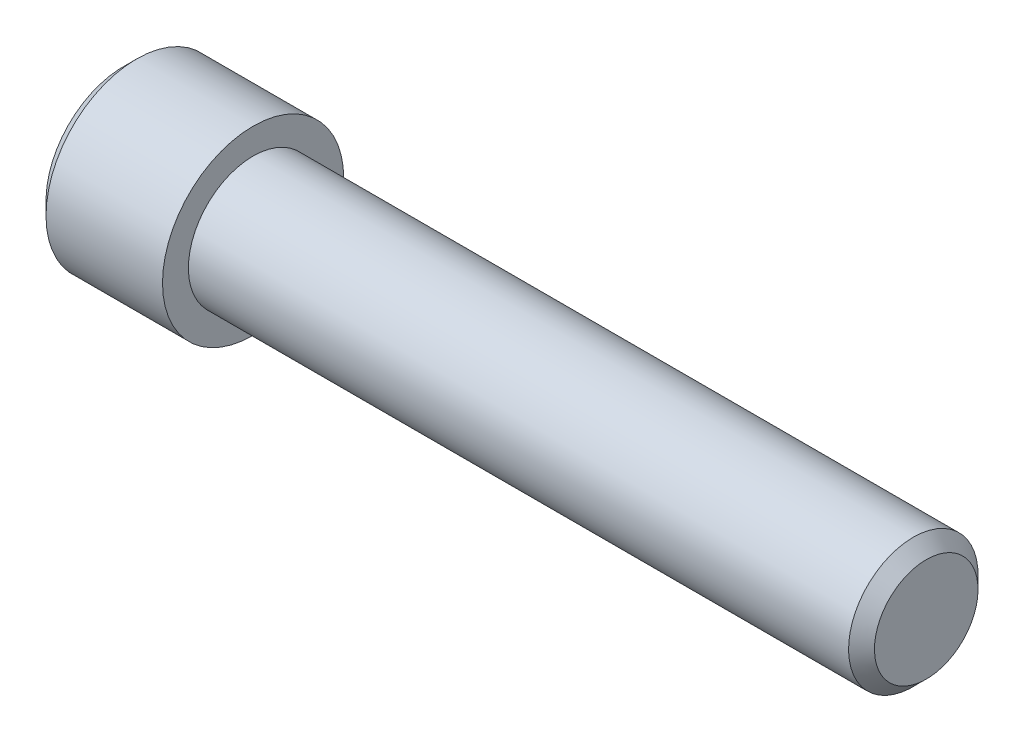
ISO-10303-21;
HEADER;
FILE_DESCRIPTION(('STEP AP214'),'2;1');
FILE_NAME('part.step','',(''),(''),'','','');
FILE_SCHEMA(('AUTOMOTIVE_DESIGN { 1 0 10303 214 1 1 1 1 }'));
ENDSEC;
DATA;
#1=APPLICATION_CONTEXT('core data for automotive mechanical design processes');
#2=APPLICATION_PROTOCOL_DEFINITION('international standard','automotive_design',2000,#1);
#3=PRODUCT_CONTEXT('',#1,'mechanical');
#4=PRODUCT('Part','Part','',(#3));
#5=PRODUCT_RELATED_PRODUCT_CATEGORY('part','',(#4));
#6=PRODUCT_DEFINITION_FORMATION('','',#4);
#7=PRODUCT_DEFINITION_CONTEXT('part definition',#1,'design');
#8=PRODUCT_DEFINITION('design','',#6,#7);
#9=PRODUCT_DEFINITION_SHAPE('','',#8);
#10=(LENGTH_UNIT() NAMED_UNIT(*) SI_UNIT(.MILLI.,.METRE.));
#11=(NAMED_UNIT(*) PLANE_ANGLE_UNIT() SI_UNIT($,.RADIAN.));
#12=(NAMED_UNIT(*) SI_UNIT($,.STERADIAN.) SOLID_ANGLE_UNIT());
#13=UNCERTAINTY_MEASURE_WITH_UNIT(LENGTH_MEASURE(1.E-05),#10,'distance_accuracy_value','');
#14=(GEOMETRIC_REPRESENTATION_CONTEXT(3) GLOBAL_UNCERTAINTY_ASSIGNED_CONTEXT((#13)) GLOBAL_UNIT_ASSIGNED_CONTEXT((#10,
#11,#12)) REPRESENTATION_CONTEXT('',''));
#15=CARTESIAN_POINT('',(0.,0.,0.));
#16=DIRECTION('',(0.,0.,1.));
#17=DIRECTION('',(1.,0.,0.));
#18=AXIS2_PLACEMENT_3D('',#15,#16,#17);
#19=CARTESIAN_POINT('',(0.,0.,0.));
#20=DIRECTION('',(-1.,0.,0.));
#21=DIRECTION('',(0.,-1.,0.));
#22=AXIS2_PLACEMENT_3D('',#19,#20,#21);
#23=PLANE('',#22);
#24=CARTESIAN_POINT('',(0.,0.,0.));
#25=DIRECTION('',(-1.,0.,0.));
#26=DIRECTION('',(0.,-1.,0.));
#27=AXIS2_PLACEMENT_3D('',#24,#25,#26);
#28=CIRCLE('',#27,3.00000000000001);
#29=CARTESIAN_POINT('',(0.,-3.00000000000001,0.));
#30=VERTEX_POINT('',#29);
#31=EDGE_CURVE('E11',#30,#30,#28,.T.);
#32=ORIENTED_EDGE('',*,*,#31,.T.);
#33=EDGE_LOOP('',(#32));
#34=FACE_BOUND('',#33,.T.);
#35=DIRECTION('',(0.,0.5,-0.866025403784439));
#36=VECTOR('',#35,1.);
#37=CARTESIAN_POINT('',(0.,1.25,2.1650635094611));
#38=LINE('',#37,#36);
#39=CARTESIAN_POINT('',(0.,1.25,2.1650635094611));
#40=VERTEX_POINT('',#39);
#41=CARTESIAN_POINT('',(0.,2.5,0.));
#42=VERTEX_POINT('',#41);
#43=EDGE_CURVE('E67',#40,#42,#38,.T.);
#44=ORIENTED_EDGE('',*,*,#43,.F.);
#45=DIRECTION('',(0.,1.,0.));
#46=VECTOR('',#45,1.);
#47=CARTESIAN_POINT('',(0.,-1.25,2.1650635094611));
#48=LINE('',#47,#46);
#49=CARTESIAN_POINT('',(0.,-1.25,2.1650635094611));
#50=VERTEX_POINT('',#49);
#51=EDGE_CURVE('E150',#50,#40,#48,.T.);
#52=ORIENTED_EDGE('',*,*,#51,.F.);
#53=DIRECTION('',(0.,0.5,0.866025403784439));
#54=VECTOR('',#53,1.);
#55=CARTESIAN_POINT('',(0.,-2.5,0.));
#56=LINE('',#55,#54);
#57=CARTESIAN_POINT('',(0.,-2.5,0.));
#58=VERTEX_POINT('',#57);
#59=EDGE_CURVE('E148',#58,#50,#56,.T.);
#60=ORIENTED_EDGE('',*,*,#59,.F.);
#61=DIRECTION('',(0.,-0.5,0.866025403784439));
#62=VECTOR('',#61,1.);
#63=CARTESIAN_POINT('',(0.,-1.25,-2.1650635094611));
#64=LINE('',#63,#62);
#65=CARTESIAN_POINT('',(0.,-1.25,-2.1650635094611));
#66=VERTEX_POINT('',#65);
#67=EDGE_CURVE('E115',#66,#58,#64,.T.);
#68=ORIENTED_EDGE('',*,*,#67,.F.);
#69=DIRECTION('',(0.,-1.,0.));
#70=VECTOR('',#69,1.);
#71=CARTESIAN_POINT('',(0.,1.25,-2.1650635094611));
#72=LINE('',#71,#70);
#73=CARTESIAN_POINT('',(0.,1.25,-2.1650635094611));
#74=VERTEX_POINT('',#73);
#75=EDGE_CURVE('E144',#74,#66,#72,.T.);
#76=ORIENTED_EDGE('',*,*,#75,.F.);
#77=DIRECTION('',(0.,-0.5,-0.866025403784439));
#78=VECTOR('',#77,1.);
#79=CARTESIAN_POINT('',(0.,2.5,0.));
#80=LINE('',#79,#78);
#81=EDGE_CURVE('E141',#42,#74,#80,.T.);
#82=ORIENTED_EDGE('',*,*,#81,.F.);
#83=EDGE_LOOP('',(#44,#52,#60,#68,#76,#82));
#84=FACE_BOUND('',#83,.T.);
#85=ADVANCED_FACE('F51',(#34,#84),#23,.T.);
#86=CARTESIAN_POINT('',(31.,0.,0.));
#87=DIRECTION('',(1.,0.,0.));
#88=DIRECTION('',(0.,1.,0.));
#89=AXIS2_PLACEMENT_3D('',#86,#87,#88);
#90=CYLINDRICAL_SURFACE('',#89,3.5);
#91=CARTESIAN_POINT('',(0.499999999999994,0.,0.));
#92=DIRECTION('',(-1.,0.,0.));
#93=DIRECTION('',(0.,-1.,0.));
#94=AXIS2_PLACEMENT_3D('',#91,#92,#93);
#95=CIRCLE('',#94,3.5);
#96=CARTESIAN_POINT('',(0.499999999999994,-3.5,0.));
#97=VERTEX_POINT('',#96);
#98=EDGE_CURVE('E60',#97,#97,#95,.F.);
#99=ORIENTED_EDGE('',*,*,#98,.T.);
#100=EDGE_LOOP('',(#99));
#101=FACE_BOUND('',#100,.T.);
#102=CARTESIAN_POINT('',(5.,0.,0.));
#103=DIRECTION('',(1.,0.,0.));
#104=DIRECTION('',(0.,1.,0.));
#105=AXIS2_PLACEMENT_3D('',#102,#103,#104);
#106=CIRCLE('',#105,3.5);
#107=CARTESIAN_POINT('',(5.,3.5,0.));
#108=VERTEX_POINT('',#107);
#109=EDGE_CURVE('E162',#108,#108,#106,.T.);
#110=ORIENTED_EDGE('',*,*,#109,.F.);
#111=EDGE_LOOP('',(#110));
#112=FACE_BOUND('',#111,.T.);
#113=ADVANCED_FACE('F173',(#101,#112),#90,.T.);
#114=CARTESIAN_POINT('',(5.,3.5,0.));
#115=DIRECTION('',(1.,0.,0.));
#116=DIRECTION('',(0.,1.,0.));
#117=AXIS2_PLACEMENT_3D('',#114,#115,#116);
#118=PLANE('',#117);
#119=ORIENTED_EDGE('',*,*,#109,.T.);
#120=EDGE_LOOP('',(#119));
#121=FACE_BOUND('',#120,.T.);
#122=CARTESIAN_POINT('',(5.,0.,0.));
#123=DIRECTION('',(1.,0.,0.));
#124=DIRECTION('',(0.,1.,0.));
#125=AXIS2_PLACEMENT_3D('',#122,#123,#124);
#126=CIRCLE('',#125,2.5);
#127=CARTESIAN_POINT('',(5.,2.5,0.));
#128=VERTEX_POINT('',#127);
#129=EDGE_CURVE('E154',#128,#128,#126,.T.);
#130=ORIENTED_EDGE('',*,*,#129,.F.);
#131=EDGE_LOOP('',(#130));
#132=FACE_BOUND('',#131,.T.);
#133=ADVANCED_FACE('F192',(#121,#132),#118,.T.);
#134=CARTESIAN_POINT('',(31.,0.,0.));
#135=DIRECTION('',(1.,0.,0.));
#136=DIRECTION('',(0.,1.,0.));
#137=AXIS2_PLACEMENT_3D('',#134,#135,#136);
#138=CYLINDRICAL_SURFACE('',#137,2.5);
#139=CARTESIAN_POINT('',(30.5,0.,0.));
#140=DIRECTION('',(1.,0.,0.));
#141=DIRECTION('',(0.,1.,0.));
#142=AXIS2_PLACEMENT_3D('',#139,#140,#141);
#143=CIRCLE('',#142,2.5);
#144=CARTESIAN_POINT('',(30.5,2.50000000000001,0.));
#145=VERTEX_POINT('',#144);
#146=EDGE_CURVE('E168',#145,#145,#143,.F.);
#147=ORIENTED_EDGE('',*,*,#146,.T.);
#148=EDGE_LOOP('',(#147));
#149=FACE_BOUND('',#148,.T.);
#150=ORIENTED_EDGE('',*,*,#129,.T.);
#151=EDGE_LOOP('',(#150));
#152=FACE_BOUND('',#151,.T.);
#153=ADVANCED_FACE('F203',(#149,#152),#138,.T.);
#154=CARTESIAN_POINT('',(31.,2.5,0.));
#155=DIRECTION('',(1.,0.,0.));
#156=DIRECTION('',(0.,1.,0.));
#157=AXIS2_PLACEMENT_3D('',#154,#155,#156);
#158=PLANE('',#157);
#159=CARTESIAN_POINT('',(31.,0.,0.));
#160=DIRECTION('',(1.,0.,0.));
#161=DIRECTION('',(0.,1.,0.));
#162=AXIS2_PLACEMENT_3D('',#159,#160,#161);
#163=CIRCLE('',#162,2.);
#164=CARTESIAN_POINT('',(31.,2.,0.));
#165=VERTEX_POINT('',#164);
#166=EDGE_CURVE('E165',#165,#165,#163,.T.);
#167=ORIENTED_EDGE('',*,*,#166,.T.);
#168=EDGE_LOOP('',(#167));
#169=FACE_BOUND('',#168,.T.);
#170=ADVANCED_FACE('F207',(#169),#158,.T.);
#171=CARTESIAN_POINT('',(3.,1.25,2.1650635094611));
#172=DIRECTION('',(0.,0.866025403784439,0.5));
#173=DIRECTION('',(0.,-0.5,0.866025403784439));
#174=AXIS2_PLACEMENT_3D('',#171,#172,#173);
#175=PLANE('',#174);
#176=ORIENTED_EDGE('',*,*,#43,.T.);
#177=DIRECTION('',(-1.,0.,0.));
#178=VECTOR('',#177,1.);
#179=CARTESIAN_POINT('',(3.,2.5,0.));
#180=LINE('',#179,#178);
#181=CARTESIAN_POINT('',(3.,2.5,0.));
#182=VERTEX_POINT('',#181);
#183=EDGE_CURVE('E97',#182,#42,#180,.T.);
#184=ORIENTED_EDGE('',*,*,#183,.F.);
#185=DIRECTION('',(0.,0.5,-0.866025403784439));
#186=VECTOR('',#185,1.);
#187=CARTESIAN_POINT('',(3.,1.25,2.1650635094611));
#188=LINE('',#187,#186);
#189=CARTESIAN_POINT('',(3.,1.25,2.1650635094611));
#190=VERTEX_POINT('',#189);
#191=EDGE_CURVE('E152',#190,#182,#188,.T.);
#192=ORIENTED_EDGE('',*,*,#191,.F.);
#193=DIRECTION('',(-1.,0.,0.));
#194=VECTOR('',#193,1.);
#195=CARTESIAN_POINT('',(3.,1.25,2.1650635094611));
#196=LINE('',#195,#194);
#197=EDGE_CURVE('E75',#190,#40,#196,.T.);
#198=ORIENTED_EDGE('',*,*,#197,.T.);
#199=EDGE_LOOP('',(#176,#184,#192,#198));
#200=FACE_BOUND('',#199,.T.);
#201=ADVANCED_FACE('F211',(#200),#175,.F.);
#202=CARTESIAN_POINT('',(3.,-1.25,2.1650635094611));
#203=DIRECTION('',(0.,0.,1.));
#204=DIRECTION('',(1.,0.,0.));
#205=AXIS2_PLACEMENT_3D('',#202,#203,#204);
#206=PLANE('',#205);
#207=ORIENTED_EDGE('',*,*,#51,.T.);
#208=ORIENTED_EDGE('',*,*,#197,.F.);
#209=DIRECTION('',(0.,1.,0.));
#210=VECTOR('',#209,1.);
#211=CARTESIAN_POINT('',(3.,-1.25,2.1650635094611));
#212=LINE('',#211,#210);
#213=CARTESIAN_POINT('',(3.,-1.25,2.1650635094611));
#214=VERTEX_POINT('',#213);
#215=EDGE_CURVE('E127',#214,#190,#212,.T.);
#216=ORIENTED_EDGE('',*,*,#215,.F.);
#217=DIRECTION('',(-1.,0.,0.));
#218=VECTOR('',#217,1.);
#219=CARTESIAN_POINT('',(3.,-1.25,2.1650635094611));
#220=LINE('',#219,#218);
#221=EDGE_CURVE('E119',#214,#50,#220,.T.);
#222=ORIENTED_EDGE('',*,*,#221,.T.);
#223=EDGE_LOOP('',(#207,#208,#216,#222));
#224=FACE_BOUND('',#223,.T.);
#225=ADVANCED_FACE('F215',(#224),#206,.F.);
#226=CARTESIAN_POINT('',(3.,-2.5,0.));
#227=DIRECTION('',(0.,-0.866025403784439,0.5));
#228=DIRECTION('',(0.,-0.5,-0.866025403784439));
#229=AXIS2_PLACEMENT_3D('',#226,#227,#228);
#230=PLANE('',#229);
#231=ORIENTED_EDGE('',*,*,#59,.T.);
#232=ORIENTED_EDGE('',*,*,#221,.F.);
#233=DIRECTION('',(0.,0.5,0.866025403784439));
#234=VECTOR('',#233,1.);
#235=CARTESIAN_POINT('',(3.,-2.5,0.));
#236=LINE('',#235,#234);
#237=CARTESIAN_POINT('',(3.,-2.5,0.));
#238=VERTEX_POINT('',#237);
#239=EDGE_CURVE('E123',#238,#214,#236,.T.);
#240=ORIENTED_EDGE('',*,*,#239,.F.);
#241=DIRECTION('',(-1.,0.,0.));
#242=VECTOR('',#241,1.);
#243=CARTESIAN_POINT('',(3.,-2.5,0.));
#244=LINE('',#243,#242);
#245=EDGE_CURVE('E108',#238,#58,#244,.T.);
#246=ORIENTED_EDGE('',*,*,#245,.T.);
#247=EDGE_LOOP('',(#231,#232,#240,#246));
#248=FACE_BOUND('',#247,.T.);
#249=ADVANCED_FACE('F124',(#248),#230,.F.);
#250=CARTESIAN_POINT('',(3.,-1.25,-2.1650635094611));
#251=DIRECTION('',(0.,-0.866025403784438,-0.5));
#252=DIRECTION('',(0.,0.5,-0.866025403784439));
#253=AXIS2_PLACEMENT_3D('',#250,#251,#252);
#254=PLANE('',#253);
#255=ORIENTED_EDGE('',*,*,#67,.T.);
#256=ORIENTED_EDGE('',*,*,#245,.F.);
#257=DIRECTION('',(0.,-0.5,0.866025403784439));
#258=VECTOR('',#257,1.);
#259=CARTESIAN_POINT('',(3.,-1.25,-2.1650635094611));
#260=LINE('',#259,#258);
#261=CARTESIAN_POINT('',(3.,-1.25,-2.1650635094611));
#262=VERTEX_POINT('',#261);
#263=EDGE_CURVE('E112',#262,#238,#260,.T.);
#264=ORIENTED_EDGE('',*,*,#263,.F.);
#265=DIRECTION('',(-1.,0.,0.));
#266=VECTOR('',#265,1.);
#267=CARTESIAN_POINT('',(3.,-1.25,-2.1650635094611));
#268=LINE('',#267,#266);
#269=EDGE_CURVE('E120',#262,#66,#268,.T.);
#270=ORIENTED_EDGE('',*,*,#269,.T.);
#271=EDGE_LOOP('',(#255,#256,#264,#270));
#272=FACE_BOUND('',#271,.T.);
#273=ADVANCED_FACE('F110',(#272),#254,.F.);
#274=CARTESIAN_POINT('',(3.,1.25,-2.1650635094611));
#275=DIRECTION('',(0.,0.,-1.));
#276=DIRECTION('',(-1.,0.,0.));
#277=AXIS2_PLACEMENT_3D('',#274,#275,#276);
#278=PLANE('',#277);
#279=ORIENTED_EDGE('',*,*,#75,.T.);
#280=ORIENTED_EDGE('',*,*,#269,.F.);
#281=DIRECTION('',(0.,-1.,0.));
#282=VECTOR('',#281,1.);
#283=CARTESIAN_POINT('',(3.,1.25,-2.1650635094611));
#284=LINE('',#283,#282);
#285=CARTESIAN_POINT('',(3.,1.25,-2.1650635094611));
#286=VERTEX_POINT('',#285);
#287=EDGE_CURVE('E133',#286,#262,#284,.T.);
#288=ORIENTED_EDGE('',*,*,#287,.F.);
#289=DIRECTION('',(-1.,0.,0.));
#290=VECTOR('',#289,1.);
#291=CARTESIAN_POINT('',(3.,1.25,-2.1650635094611));
#292=LINE('',#291,#290);
#293=EDGE_CURVE('E157',#286,#74,#292,.T.);
#294=ORIENTED_EDGE('',*,*,#293,.T.);
#295=EDGE_LOOP('',(#279,#280,#288,#294));
#296=FACE_BOUND('',#295,.T.);
#297=ADVANCED_FACE('F219',(#296),#278,.F.);
#298=CARTESIAN_POINT('',(3.,2.5,0.));
#299=DIRECTION('',(0.,0.866025403784439,-0.5));
#300=DIRECTION('',(0.,0.5,0.866025403784439));
#301=AXIS2_PLACEMENT_3D('',#298,#299,#300);
#302=PLANE('',#301);
#303=ORIENTED_EDGE('',*,*,#81,.T.);
#304=ORIENTED_EDGE('',*,*,#293,.F.);
#305=DIRECTION('',(0.,-0.5,-0.866025403784439));
#306=VECTOR('',#305,1.);
#307=CARTESIAN_POINT('',(3.,2.5,0.));
#308=LINE('',#307,#306);
#309=EDGE_CURVE('E135',#182,#286,#308,.T.);
#310=ORIENTED_EDGE('',*,*,#309,.F.);
#311=ORIENTED_EDGE('',*,*,#183,.T.);
#312=EDGE_LOOP('',(#303,#304,#310,#311));
#313=FACE_BOUND('',#312,.T.);
#314=ADVANCED_FACE('F216',(#313),#302,.F.);
#315=CARTESIAN_POINT('',(3.,0.,0.));
#316=DIRECTION('',(-1.,0.,0.));
#317=DIRECTION('',(0.,-1.,0.));
#318=AXIS2_PLACEMENT_3D('',#315,#316,#317);
#319=PLANE('',#318);
#320=ORIENTED_EDGE('',*,*,#191,.T.);
#321=ORIENTED_EDGE('',*,*,#309,.T.);
#322=ORIENTED_EDGE('',*,*,#287,.T.);
#323=ORIENTED_EDGE('',*,*,#263,.T.);
#324=ORIENTED_EDGE('',*,*,#239,.T.);
#325=ORIENTED_EDGE('',*,*,#215,.T.);
#326=EDGE_LOOP('',(#320,#321,#322,#323,#324,#325));
#327=FACE_BOUND('',#326,.T.);
#328=ADVANCED_FACE('F130',(#327),#319,.T.);
#329=CARTESIAN_POINT('',(31.,0.,0.));
#330=DIRECTION('',(-1.,0.,0.));
#331=DIRECTION('',(0.,-1.,0.));
#332=AXIS2_PLACEMENT_3D('',#329,#330,#331);
#333=CONICAL_SURFACE('',#332,2.,0.785398163397441);
#334=ORIENTED_EDGE('',*,*,#146,.F.);
#335=EDGE_LOOP('',(#334));
#336=FACE_BOUND('',#335,.T.);
#337=ORIENTED_EDGE('',*,*,#166,.F.);
#338=EDGE_LOOP('',(#337));
#339=FACE_BOUND('',#338,.T.);
#340=ADVANCED_FACE('F177',(#336,#339),#333,.T.);
#341=CARTESIAN_POINT('',(0.499999999999994,0.,0.));
#342=DIRECTION('',(1.,0.,0.));
#343=DIRECTION('',(0.,1.,0.));
#344=AXIS2_PLACEMENT_3D('',#341,#342,#343);
#345=CONICAL_SURFACE('',#344,3.5,0.785398163397452);
#346=ORIENTED_EDGE('',*,*,#31,.F.);
#347=EDGE_LOOP('',(#346));
#348=FACE_BOUND('',#347,.T.);
#349=ORIENTED_EDGE('',*,*,#98,.F.);
#350=EDGE_LOOP('',(#349));
#351=FACE_BOUND('',#350,.T.);
#352=ADVANCED_FACE('F54',(#348,#351),#345,.T.);
#353=CLOSED_SHELL('',(#85,#113,#133,#153,#170,#201,#225,#249,#273,#297,#314,#328,#340,#352));
#354=MANIFOLD_SOLID_BREP('B2',#353);
#355=ADVANCED_BREP_SHAPE_REPRESENTATION('',(#18,#354),#14);
#356=SHAPE_DEFINITION_REPRESENTATION(#9,#355);
ENDSEC;
END-ISO-10303-21;
